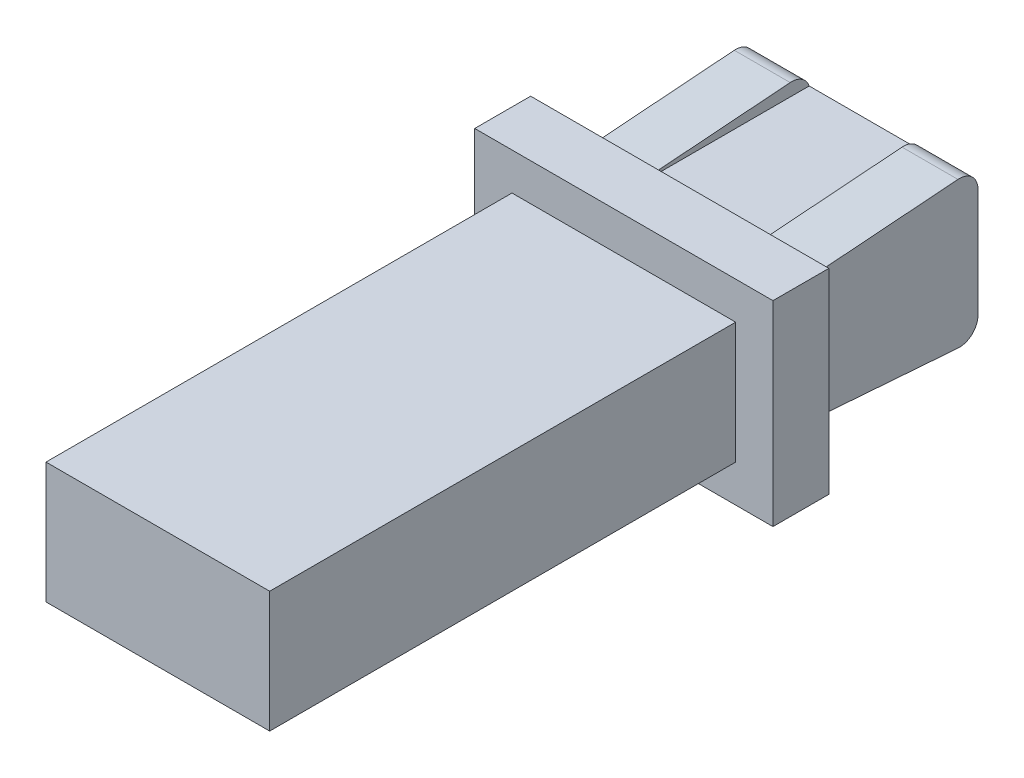
ISO-10303-21;
HEADER;
FILE_DESCRIPTION(('STEP AP214'),'2;1');
FILE_NAME('part.step','',(''),(''),'','','');
FILE_SCHEMA(('AUTOMOTIVE_DESIGN { 1 0 10303 214 1 1 1 1 }'));
ENDSEC;
DATA;
#1=APPLICATION_CONTEXT('core data for automotive mechanical design processes');
#2=APPLICATION_PROTOCOL_DEFINITION('international standard','automotive_design',2000,#1);
#3=PRODUCT_CONTEXT('',#1,'mechanical');
#4=PRODUCT('Part','Part','',(#3));
#5=PRODUCT_RELATED_PRODUCT_CATEGORY('part','',(#4));
#6=PRODUCT_DEFINITION_FORMATION('','',#4);
#7=PRODUCT_DEFINITION_CONTEXT('part definition',#1,'design');
#8=PRODUCT_DEFINITION('design','',#6,#7);
#9=PRODUCT_DEFINITION_SHAPE('','',#8);
#10=(LENGTH_UNIT() NAMED_UNIT(*) SI_UNIT(.MILLI.,.METRE.));
#11=(NAMED_UNIT(*) PLANE_ANGLE_UNIT() SI_UNIT($,.RADIAN.));
#12=(NAMED_UNIT(*) SI_UNIT($,.STERADIAN.) SOLID_ANGLE_UNIT());
#13=UNCERTAINTY_MEASURE_WITH_UNIT(LENGTH_MEASURE(1.E-05),#10,'distance_accuracy_value','');
#14=(GEOMETRIC_REPRESENTATION_CONTEXT(3) GLOBAL_UNCERTAINTY_ASSIGNED_CONTEXT((#13)) GLOBAL_UNIT_ASSIGNED_CONTEXT((#10,
#11,#12)) REPRESENTATION_CONTEXT('',''));
#15=CARTESIAN_POINT('',(0.,0.,0.));
#16=DIRECTION('',(0.,0.,1.));
#17=DIRECTION('',(1.,0.,0.));
#18=AXIS2_PLACEMENT_3D('',#15,#16,#17);
#19=CARTESIAN_POINT('',(-16.0280855600658,-3.25000000000001,10.));
#20=DIRECTION('',(0.,-0.997199309888456,0.0747899482416342));
#21=DIRECTION('',(0.,-0.0747899482416342,-0.997199309888456));
#22=AXIS2_PLACEMENT_3D('',#19,#20,#21);
#23=PLANE('',#22);
#24=DIRECTION('',(0.,-0.0747899482416342,-0.997199309888456));
#25=VECTOR('',#24,1.);
#26=CARTESIAN_POINT('',(3.,-1.1654317731485,37.7942430246866));
#27=LINE('',#26,#25);
#28=CARTESIAN_POINT('',(3.,-3.25,10.));
#29=VERTEX_POINT('',#28);
#30=CARTESIAN_POINT('',(3.,-3.91939075388188,1.07478994824164));
#31=VERTEX_POINT('',#30);
#32=EDGE_CURVE('E233',#29,#31,#27,.T.);
#33=ORIENTED_EDGE('',*,*,#32,.T.);
#34=DIRECTION('',(1.,0.,0.));
#35=VECTOR('',#34,1.);
#36=CARTESIAN_POINT('',(6.,-3.91939075388188,1.07478994824164));
#37=LINE('',#36,#35);
#38=CARTESIAN_POINT('',(6.,-3.91939075388188,1.07478994824164));
#39=VERTEX_POINT('',#38);
#40=EDGE_CURVE('E363',#31,#39,#37,.T.);
#41=ORIENTED_EDGE('',*,*,#40,.T.);
#42=DIRECTION('',(0.,-0.0747899482416342,-0.997199309888456));
#43=VECTOR('',#42,1.);
#44=CARTESIAN_POINT('',(6.,-3.25,10.));
#45=LINE('',#44,#43);
#46=CARTESIAN_POINT('',(6.,-3.25,10.));
#47=VERTEX_POINT('',#46);
#48=EDGE_CURVE('E257',#47,#39,#45,.T.);
#49=ORIENTED_EDGE('',*,*,#48,.F.);
#50=DIRECTION('',(1.,0.,0.));
#51=VECTOR('',#50,1.);
#52=CARTESIAN_POINT('',(-6.,-3.25,10.));
#53=LINE('',#52,#51);
#54=EDGE_CURVE('E359',#29,#47,#53,.T.);
#55=ORIENTED_EDGE('',*,*,#54,.F.);
#56=EDGE_LOOP('',(#33,#41,#49,#55));
#57=FACE_BOUND('',#56,.T.);
#58=ADVANCED_FACE('F38',(#57),#23,.T.);
#59=CARTESIAN_POINT('',(-16.0280855600658,3.24999999999999,10.));
#60=DIRECTION('',(0.,0.997199309888456,0.0747899482416342));
#61=DIRECTION('',(0.,-0.0747899482416342,0.997199309888456));
#62=AXIS2_PLACEMENT_3D('',#59,#60,#61);
#63=PLANE('',#62);
#64=DIRECTION('',(0.,0.0747899482416342,-0.997199309888456));
#65=VECTOR('',#64,1.);
#66=CARTESIAN_POINT('',(-3.,1.1654317731485,37.7942430246866));
#67=LINE('',#66,#65);
#68=CARTESIAN_POINT('',(-3.,3.25,10.));
#69=VERTEX_POINT('',#68);
#70=CARTESIAN_POINT('',(-3.,3.91939075388187,1.07478994824163));
#71=VERTEX_POINT('',#70);
#72=EDGE_CURVE('E177',#69,#71,#67,.T.);
#73=ORIENTED_EDGE('',*,*,#72,.T.);
#74=DIRECTION('',(1.,0.,0.));
#75=VECTOR('',#74,1.);
#76=CARTESIAN_POINT('',(-6.,3.91939075388187,1.07478994824163));
#77=LINE('',#76,#75);
#78=CARTESIAN_POINT('',(-6.,3.91939075388187,1.07478994824163));
#79=VERTEX_POINT('',#78);
#80=EDGE_CURVE('E47',#71,#79,#77,.F.);
#81=ORIENTED_EDGE('',*,*,#80,.T.);
#82=DIRECTION('',(0.,0.0747899482416342,-0.997199309888456));
#83=VECTOR('',#82,1.);
#84=CARTESIAN_POINT('',(-6.,3.25,10.));
#85=LINE('',#84,#83);
#86=CARTESIAN_POINT('',(-6.,3.25,10.));
#87=VERTEX_POINT('',#86);
#88=EDGE_CURVE('E201',#87,#79,#85,.T.);
#89=ORIENTED_EDGE('',*,*,#88,.F.);
#90=DIRECTION('',(-1.,0.,0.));
#91=VECTOR('',#90,1.);
#92=CARTESIAN_POINT('',(-6.,3.25,10.));
#93=LINE('',#92,#91);
#94=EDGE_CURVE('E198',#69,#87,#93,.T.);
#95=ORIENTED_EDGE('',*,*,#94,.F.);
#96=EDGE_LOOP('',(#73,#81,#89,#95));
#97=FACE_BOUND('',#96,.T.);
#98=ADVANCED_FACE('F199',(#97),#63,.T.);
#99=CARTESIAN_POINT('',(6.,3.25,10.));
#100=DIRECTION('',(-1.,0.,0.));
#101=DIRECTION('',(0.,-1.,0.));
#102=AXIS2_PLACEMENT_3D('',#99,#100,#101);
#103=PLANE('',#102);
#104=ORIENTED_EDGE('',*,*,#48,.T.);
#105=CARTESIAN_POINT('',(6.,-2.92219144399342,1.));
#106=DIRECTION('',(-1.,0.,0.));
#107=DIRECTION('',(0.,-1.,0.));
#108=AXIS2_PLACEMENT_3D('',#105,#106,#107);
#109=CIRCLE('',#108,1.);
#110=CARTESIAN_POINT('',(6.,-2.92219144399342,0.));
#111=VERTEX_POINT('',#110);
#112=EDGE_CURVE('E377',#39,#111,#109,.F.);
#113=ORIENTED_EDGE('',*,*,#112,.T.);
#114=DIRECTION('',(0.,1.,0.));
#115=VECTOR('',#114,1.);
#116=CARTESIAN_POINT('',(6.,3.25,0.));
#117=LINE('',#116,#115);
#118=CARTESIAN_POINT('',(6.,2.92219144399342,0.));
#119=VERTEX_POINT('',#118);
#120=EDGE_CURVE('E351',#111,#119,#117,.T.);
#121=ORIENTED_EDGE('',*,*,#120,.T.);
#122=CARTESIAN_POINT('',(6.,2.92219144399342,1.));
#123=DIRECTION('',(-1.,0.,0.));
#124=DIRECTION('',(0.,-1.,0.));
#125=AXIS2_PLACEMENT_3D('',#122,#123,#124);
#126=CIRCLE('',#125,1.);
#127=CARTESIAN_POINT('',(6.,3.91939075388188,1.07478994824163));
#128=VERTEX_POINT('',#127);
#129=EDGE_CURVE('E374',#119,#128,#126,.F.);
#130=ORIENTED_EDGE('',*,*,#129,.T.);
#131=DIRECTION('',(0.,-0.0747899482416342,0.997199309888456));
#132=VECTOR('',#131,1.);
#133=CARTESIAN_POINT('',(6.,3.25,10.));
#134=LINE('',#133,#132);
#135=CARTESIAN_POINT('',(6.,3.25,10.));
#136=VERTEX_POINT('',#135);
#137=EDGE_CURVE('E227',#128,#136,#134,.T.);
#138=ORIENTED_EDGE('',*,*,#137,.T.);
#139=DIRECTION('',(0.,1.,0.));
#140=VECTOR('',#139,1.);
#141=CARTESIAN_POINT('',(6.,3.25,10.));
#142=LINE('',#141,#140);
#143=EDGE_CURVE('E207',#47,#136,#142,.T.);
#144=ORIENTED_EDGE('',*,*,#143,.F.);
#145=EDGE_LOOP('',(#104,#113,#121,#130,#138,#144));
#146=FACE_BOUND('',#145,.T.);
#147=ADVANCED_FACE('F406',(#146),#103,.F.);
#148=CARTESIAN_POINT('',(-6.,3.25,10.));
#149=DIRECTION('',(1.,0.,0.));
#150=DIRECTION('',(0.,1.,0.));
#151=AXIS2_PLACEMENT_3D('',#148,#149,#150);
#152=PLANE('',#151);
#153=DIRECTION('',(0.,-1.,0.));
#154=VECTOR('',#153,1.);
#155=CARTESIAN_POINT('',(-6.,3.25,0.));
#156=LINE('',#155,#154);
#157=CARTESIAN_POINT('',(-6.,2.92219144399342,0.));
#158=VERTEX_POINT('',#157);
#159=CARTESIAN_POINT('',(-6.,-2.92219144399342,0.));
#160=VERTEX_POINT('',#159);
#161=EDGE_CURVE('E353',#158,#160,#156,.T.);
#162=ORIENTED_EDGE('',*,*,#161,.T.);
#163=CARTESIAN_POINT('',(-6.,-2.92219144399342,1.));
#164=DIRECTION('',(1.,0.,0.));
#165=DIRECTION('',(0.,1.,0.));
#166=AXIS2_PLACEMENT_3D('',#163,#164,#165);
#167=CIRCLE('',#166,1.);
#168=CARTESIAN_POINT('',(-6.,-3.91939075388188,1.07478994824164));
#169=VERTEX_POINT('',#168);
#170=EDGE_CURVE('E389',#160,#169,#167,.F.);
#171=ORIENTED_EDGE('',*,*,#170,.T.);
#172=DIRECTION('',(0.,0.0747899482416342,0.997199309888456));
#173=VECTOR('',#172,1.);
#174=CARTESIAN_POINT('',(-6.,-3.25,10.));
#175=LINE('',#174,#173);
#176=CARTESIAN_POINT('',(-6.,-3.25,10.));
#177=VERTEX_POINT('',#176);
#178=EDGE_CURVE('E258',#169,#177,#175,.T.);
#179=ORIENTED_EDGE('',*,*,#178,.T.);
#180=DIRECTION('',(0.,-1.,0.));
#181=VECTOR('',#180,1.);
#182=CARTESIAN_POINT('',(-6.,3.25,10.));
#183=LINE('',#182,#181);
#184=EDGE_CURVE('E356',#87,#177,#183,.T.);
#185=ORIENTED_EDGE('',*,*,#184,.F.);
#186=ORIENTED_EDGE('',*,*,#88,.T.);
#187=CARTESIAN_POINT('',(-6.,2.92219144399342,1.));
#188=DIRECTION('',(1.,0.,0.));
#189=DIRECTION('',(0.,1.,0.));
#190=AXIS2_PLACEMENT_3D('',#187,#188,#189);
#191=CIRCLE('',#190,1.);
#192=EDGE_CURVE('E387',#79,#158,#191,.F.);
#193=ORIENTED_EDGE('',*,*,#192,.T.);
#194=EDGE_LOOP('',(#162,#171,#179,#185,#186,#193));
#195=FACE_BOUND('',#194,.T.);
#196=ADVANCED_FACE('F397',(#195),#152,.F.);
#197=CARTESIAN_POINT('',(0.,0.,0.));
#198=DIRECTION('',(0.,0.,1.));
#199=DIRECTION('',(1.,0.,0.));
#200=AXIS2_PLACEMENT_3D('',#197,#198,#199);
#201=PLANE('',#200);
#202=ORIENTED_EDGE('',*,*,#120,.F.);
#203=DIRECTION('',(1.,0.,0.));
#204=VECTOR('',#203,1.);
#205=CARTESIAN_POINT('',(-6.,-2.92219144399342,0.));
#206=LINE('',#205,#204);
#207=EDGE_CURVE('E384',#111,#160,#206,.F.);
#208=ORIENTED_EDGE('',*,*,#207,.T.);
#209=ORIENTED_EDGE('',*,*,#161,.F.);
#210=DIRECTION('',(1.,0.,0.));
#211=VECTOR('',#210,1.);
#212=CARTESIAN_POINT('',(6.,2.92219144399342,0.));
#213=LINE('',#212,#211);
#214=EDGE_CURVE('E380',#158,#119,#213,.T.);
#215=ORIENTED_EDGE('',*,*,#214,.T.);
#216=EDGE_LOOP('',(#202,#208,#209,#215));
#217=FACE_BOUND('',#216,.T.);
#218=ADVANCED_FACE('F403',(#217),#201,.F.);
#219=CARTESIAN_POINT('',(0.,0.,10.));
#220=DIRECTION('',(0.,0.,1.));
#221=DIRECTION('',(1.,0.,0.));
#222=AXIS2_PLACEMENT_3D('',#219,#220,#221);
#223=PLANE('',#222);
#224=DIRECTION('',(1.,0.,0.));
#225=VECTOR('',#224,1.);
#226=CARTESIAN_POINT('',(-8.,-5.25,10.));
#227=LINE('',#226,#225);
#228=CARTESIAN_POINT('',(-8.,-5.25,10.));
#229=VERTEX_POINT('',#228);
#230=CARTESIAN_POINT('',(8.,-5.25,10.));
#231=VERTEX_POINT('',#230);
#232=EDGE_CURVE('E309',#229,#231,#227,.T.);
#233=ORIENTED_EDGE('',*,*,#232,.F.);
#234=DIRECTION('',(0.,-1.,0.));
#235=VECTOR('',#234,1.);
#236=CARTESIAN_POINT('',(-8.,5.25,10.));
#237=LINE('',#236,#235);
#238=CARTESIAN_POINT('',(-8.,5.25,10.));
#239=VERTEX_POINT('',#238);
#240=EDGE_CURVE('E315',#239,#229,#237,.T.);
#241=ORIENTED_EDGE('',*,*,#240,.F.);
#242=DIRECTION('',(-1.,0.,0.));
#243=VECTOR('',#242,1.);
#244=CARTESIAN_POINT('',(8.,5.25,10.));
#245=LINE('',#244,#243);
#246=CARTESIAN_POINT('',(8.,5.25,10.));
#247=VERTEX_POINT('',#246);
#248=EDGE_CURVE('E331',#247,#239,#245,.T.);
#249=ORIENTED_EDGE('',*,*,#248,.F.);
#250=DIRECTION('',(0.,1.,0.));
#251=VECTOR('',#250,1.);
#252=CARTESIAN_POINT('',(8.,-5.25,10.));
#253=LINE('',#252,#251);
#254=EDGE_CURVE('E328',#231,#247,#253,.T.);
#255=ORIENTED_EDGE('',*,*,#254,.F.);
#256=EDGE_LOOP('',(#233,#241,#249,#255));
#257=FACE_BOUND('',#256,.T.);
#258=CARTESIAN_POINT('',(-3.,-3.25,10.));
#259=VERTEX_POINT('',#258);
#260=EDGE_CURVE('E360',#177,#259,#53,.T.);
#261=ORIENTED_EDGE('',*,*,#260,.T.);
#262=DIRECTION('',(1.,0.,0.));
#263=VECTOR('',#262,1.);
#264=CARTESIAN_POINT('',(-6.,-3.25,10.));
#265=LINE('',#264,#263);
#266=EDGE_CURVE('E244',#259,#29,#265,.T.);
#267=ORIENTED_EDGE('',*,*,#266,.T.);
#268=ORIENTED_EDGE('',*,*,#54,.T.);
#269=ORIENTED_EDGE('',*,*,#143,.T.);
#270=CARTESIAN_POINT('',(3.,3.25,10.));
#271=VERTEX_POINT('',#270);
#272=EDGE_CURVE('E206',#136,#271,#93,.T.);
#273=ORIENTED_EDGE('',*,*,#272,.T.);
#274=DIRECTION('',(-1.,0.,0.));
#275=VECTOR('',#274,1.);
#276=CARTESIAN_POINT('',(3.0000000000001,3.25,9.99999999999998));
#277=LINE('',#276,#275);
#278=EDGE_CURVE('E193',#271,#69,#277,.T.);
#279=ORIENTED_EDGE('',*,*,#278,.T.);
#280=ORIENTED_EDGE('',*,*,#94,.T.);
#281=ORIENTED_EDGE('',*,*,#184,.T.);
#282=EDGE_LOOP('',(#261,#267,#268,#269,#273,#279,#280,#281));
#283=FACE_BOUND('',#282,.T.);
#284=ADVANCED_FACE('F211',(#257,#283),#223,.F.);
#285=CARTESIAN_POINT('',(-8.,-5.25,13.));
#286=DIRECTION('',(0.,1.,0.));
#287=DIRECTION('',(0.,0.,1.));
#288=AXIS2_PLACEMENT_3D('',#285,#286,#287);
#289=PLANE('',#288);
#290=ORIENTED_EDGE('',*,*,#232,.T.);
#291=DIRECTION('',(0.,0.,-1.));
#292=VECTOR('',#291,1.);
#293=CARTESIAN_POINT('',(8.,-5.25,13.));
#294=LINE('',#293,#292);
#295=CARTESIAN_POINT('',(8.,-5.25,13.));
#296=VERTEX_POINT('',#295);
#297=EDGE_CURVE('E347',#296,#231,#294,.T.);
#298=ORIENTED_EDGE('',*,*,#297,.F.);
#299=DIRECTION('',(1.,0.,0.));
#300=VECTOR('',#299,1.);
#301=CARTESIAN_POINT('',(-8.,-5.25,13.));
#302=LINE('',#301,#300);
#303=CARTESIAN_POINT('',(-8.,-5.25,13.));
#304=VERTEX_POINT('',#303);
#305=EDGE_CURVE('E310',#304,#296,#302,.T.);
#306=ORIENTED_EDGE('',*,*,#305,.F.);
#307=DIRECTION('',(0.,0.,-1.));
#308=VECTOR('',#307,1.);
#309=CARTESIAN_POINT('',(-8.,-5.25,13.));
#310=LINE('',#309,#308);
#311=EDGE_CURVE('E324',#304,#229,#310,.T.);
#312=ORIENTED_EDGE('',*,*,#311,.T.);
#313=EDGE_LOOP('',(#290,#298,#306,#312));
#314=FACE_BOUND('',#313,.T.);
#315=ADVANCED_FACE('F478',(#314),#289,.F.);
#316=CARTESIAN_POINT('',(8.,-5.25,13.));
#317=DIRECTION('',(-1.,0.,0.));
#318=DIRECTION('',(0.,-1.,0.));
#319=AXIS2_PLACEMENT_3D('',#316,#317,#318);
#320=PLANE('',#319);
#321=ORIENTED_EDGE('',*,*,#254,.T.);
#322=DIRECTION('',(0.,0.,-1.));
#323=VECTOR('',#322,1.);
#324=CARTESIAN_POINT('',(8.,5.25,13.));
#325=LINE('',#324,#323);
#326=CARTESIAN_POINT('',(8.,5.25,13.));
#327=VERTEX_POINT('',#326);
#328=EDGE_CURVE('E343',#327,#247,#325,.T.);
#329=ORIENTED_EDGE('',*,*,#328,.F.);
#330=DIRECTION('',(0.,1.,0.));
#331=VECTOR('',#330,1.);
#332=CARTESIAN_POINT('',(8.,-5.25,13.));
#333=LINE('',#332,#331);
#334=EDGE_CURVE('E314',#296,#327,#333,.T.);
#335=ORIENTED_EDGE('',*,*,#334,.F.);
#336=ORIENTED_EDGE('',*,*,#297,.T.);
#337=EDGE_LOOP('',(#321,#329,#335,#336));
#338=FACE_BOUND('',#337,.T.);
#339=ADVANCED_FACE('F486',(#338),#320,.F.);
#340=CARTESIAN_POINT('',(8.,5.25,13.));
#341=DIRECTION('',(0.,-1.,0.));
#342=DIRECTION('',(0.,0.,-1.));
#343=AXIS2_PLACEMENT_3D('',#340,#341,#342);
#344=PLANE('',#343);
#345=ORIENTED_EDGE('',*,*,#248,.T.);
#346=DIRECTION('',(0.,0.,-1.));
#347=VECTOR('',#346,1.);
#348=CARTESIAN_POINT('',(-8.,5.25,13.));
#349=LINE('',#348,#347);
#350=CARTESIAN_POINT('',(-8.,5.25,13.));
#351=VERTEX_POINT('',#350);
#352=EDGE_CURVE('E339',#351,#239,#349,.T.);
#353=ORIENTED_EDGE('',*,*,#352,.F.);
#354=DIRECTION('',(-1.,0.,0.));
#355=VECTOR('',#354,1.);
#356=CARTESIAN_POINT('',(8.,5.25,13.));
#357=LINE('',#356,#355);
#358=EDGE_CURVE('E318',#327,#351,#357,.T.);
#359=ORIENTED_EDGE('',*,*,#358,.F.);
#360=ORIENTED_EDGE('',*,*,#328,.T.);
#361=EDGE_LOOP('',(#345,#353,#359,#360));
#362=FACE_BOUND('',#361,.T.);
#363=ADVANCED_FACE('F482',(#362),#344,.F.);
#364=CARTESIAN_POINT('',(-8.,5.25,13.));
#365=DIRECTION('',(1.,0.,0.));
#366=DIRECTION('',(0.,1.,0.));
#367=AXIS2_PLACEMENT_3D('',#364,#365,#366);
#368=PLANE('',#367);
#369=ORIENTED_EDGE('',*,*,#240,.T.);
#370=ORIENTED_EDGE('',*,*,#311,.F.);
#371=DIRECTION('',(0.,-1.,0.));
#372=VECTOR('',#371,1.);
#373=CARTESIAN_POINT('',(-8.,5.25,13.));
#374=LINE('',#373,#372);
#375=EDGE_CURVE('E321',#351,#304,#374,.T.);
#376=ORIENTED_EDGE('',*,*,#375,.F.);
#377=ORIENTED_EDGE('',*,*,#352,.T.);
#378=EDGE_LOOP('',(#369,#370,#376,#377));
#379=FACE_BOUND('',#378,.T.);
#380=ADVANCED_FACE('F474',(#379),#368,.F.);
#381=CARTESIAN_POINT('',(0.,0.,13.));
#382=DIRECTION('',(0.,0.,1.));
#383=DIRECTION('',(1.,0.,0.));
#384=AXIS2_PLACEMENT_3D('',#381,#382,#383);
#385=PLANE('',#384);
#386=DIRECTION('',(0.,-1.,0.));
#387=VECTOR('',#386,1.);
#388=CARTESIAN_POINT('',(-6.,3.25,13.));
#389=LINE('',#388,#387);
#390=CARTESIAN_POINT('',(-6.,3.25,13.));
#391=VERTEX_POINT('',#390);
#392=CARTESIAN_POINT('',(-6.,-3.25,13.));
#393=VERTEX_POINT('',#392);
#394=EDGE_CURVE('E261',#391,#393,#389,.T.);
#395=ORIENTED_EDGE('',*,*,#394,.F.);
#396=DIRECTION('',(-1.,0.,0.));
#397=VECTOR('',#396,1.);
#398=CARTESIAN_POINT('',(6.,3.25,13.));
#399=LINE('',#398,#397);
#400=CARTESIAN_POINT('',(6.,3.25,13.));
#401=VERTEX_POINT('',#400);
#402=EDGE_CURVE('E270',#401,#391,#399,.T.);
#403=ORIENTED_EDGE('',*,*,#402,.F.);
#404=DIRECTION('',(0.,1.,0.));
#405=VECTOR('',#404,1.);
#406=CARTESIAN_POINT('',(6.,-3.25,13.));
#407=LINE('',#406,#405);
#408=CARTESIAN_POINT('',(6.,-3.25,13.));
#409=VERTEX_POINT('',#408);
#410=EDGE_CURVE('E287',#409,#401,#407,.T.);
#411=ORIENTED_EDGE('',*,*,#410,.F.);
#412=DIRECTION('',(1.,0.,0.));
#413=VECTOR('',#412,1.);
#414=CARTESIAN_POINT('',(-6.,-3.25,13.));
#415=LINE('',#414,#413);
#416=EDGE_CURVE('E283',#393,#409,#415,.T.);
#417=ORIENTED_EDGE('',*,*,#416,.F.);
#418=EDGE_LOOP('',(#395,#403,#411,#417));
#419=FACE_BOUND('',#418,.T.);
#420=ORIENTED_EDGE('',*,*,#305,.T.);
#421=ORIENTED_EDGE('',*,*,#334,.T.);
#422=ORIENTED_EDGE('',*,*,#358,.T.);
#423=ORIENTED_EDGE('',*,*,#375,.T.);
#424=EDGE_LOOP('',(#420,#421,#422,#423));
#425=FACE_BOUND('',#424,.T.);
#426=ADVANCED_FACE('F470',(#419,#425),#385,.T.);
#427=CARTESIAN_POINT('',(-6.,3.25,38.));
#428=DIRECTION('',(1.,0.,0.));
#429=DIRECTION('',(0.,1.,0.));
#430=AXIS2_PLACEMENT_3D('',#427,#428,#429);
#431=PLANE('',#430);
#432=ORIENTED_EDGE('',*,*,#394,.T.);
#433=DIRECTION('',(0.,0.,-1.));
#434=VECTOR('',#433,1.);
#435=CARTESIAN_POINT('',(-6.,-3.25,38.));
#436=LINE('',#435,#434);
#437=CARTESIAN_POINT('',(-6.,-3.25,38.));
#438=VERTEX_POINT('',#437);
#439=EDGE_CURVE('E305',#438,#393,#436,.T.);
#440=ORIENTED_EDGE('',*,*,#439,.F.);
#441=DIRECTION('',(0.,-1.,0.));
#442=VECTOR('',#441,1.);
#443=CARTESIAN_POINT('',(-6.,3.25,38.));
#444=LINE('',#443,#442);
#445=CARTESIAN_POINT('',(-6.,3.25,38.));
#446=VERTEX_POINT('',#445);
#447=EDGE_CURVE('E265',#446,#438,#444,.T.);
#448=ORIENTED_EDGE('',*,*,#447,.F.);
#449=DIRECTION('',(0.,0.,-1.));
#450=VECTOR('',#449,1.);
#451=CARTESIAN_POINT('',(-6.,3.25,38.));
#452=LINE('',#451,#450);
#453=EDGE_CURVE('E279',#446,#391,#452,.T.);
#454=ORIENTED_EDGE('',*,*,#453,.T.);
#455=EDGE_LOOP('',(#432,#440,#448,#454));
#456=FACE_BOUND('',#455,.T.);
#457=ADVANCED_FACE('F466',(#456),#431,.F.);
#458=CARTESIAN_POINT('',(-6.,-3.25,38.));
#459=DIRECTION('',(0.,1.,0.));
#460=DIRECTION('',(0.,0.,1.));
#461=AXIS2_PLACEMENT_3D('',#458,#459,#460);
#462=PLANE('',#461);
#463=ORIENTED_EDGE('',*,*,#416,.T.);
#464=DIRECTION('',(0.,0.,-1.));
#465=VECTOR('',#464,1.);
#466=CARTESIAN_POINT('',(6.,-3.25,38.));
#467=LINE('',#466,#465);
#468=CARTESIAN_POINT('',(6.,-3.25,38.));
#469=VERTEX_POINT('',#468);
#470=EDGE_CURVE('E301',#469,#409,#467,.T.);
#471=ORIENTED_EDGE('',*,*,#470,.F.);
#472=DIRECTION('',(1.,0.,0.));
#473=VECTOR('',#472,1.);
#474=CARTESIAN_POINT('',(-6.,-3.25,38.));
#475=LINE('',#474,#473);
#476=EDGE_CURVE('E269',#438,#469,#475,.T.);
#477=ORIENTED_EDGE('',*,*,#476,.F.);
#478=ORIENTED_EDGE('',*,*,#439,.T.);
#479=EDGE_LOOP('',(#463,#471,#477,#478));
#480=FACE_BOUND('',#479,.T.);
#481=ADVANCED_FACE('F462',(#480),#462,.F.);
#482=CARTESIAN_POINT('',(6.,-3.25,38.));
#483=DIRECTION('',(-1.,0.,0.));
#484=DIRECTION('',(0.,-1.,0.));
#485=AXIS2_PLACEMENT_3D('',#482,#483,#484);
#486=PLANE('',#485);
#487=ORIENTED_EDGE('',*,*,#410,.T.);
#488=DIRECTION('',(0.,0.,-1.));
#489=VECTOR('',#488,1.);
#490=CARTESIAN_POINT('',(6.,3.25,38.));
#491=LINE('',#490,#489);
#492=CARTESIAN_POINT('',(6.,3.25,38.));
#493=VERTEX_POINT('',#492);
#494=EDGE_CURVE('E297',#493,#401,#491,.T.);
#495=ORIENTED_EDGE('',*,*,#494,.F.);
#496=DIRECTION('',(0.,1.,0.));
#497=VECTOR('',#496,1.);
#498=CARTESIAN_POINT('',(6.,-3.25,38.));
#499=LINE('',#498,#497);
#500=EDGE_CURVE('E273',#469,#493,#499,.T.);
#501=ORIENTED_EDGE('',*,*,#500,.F.);
#502=ORIENTED_EDGE('',*,*,#470,.T.);
#503=EDGE_LOOP('',(#487,#495,#501,#502));
#504=FACE_BOUND('',#503,.T.);
#505=ADVANCED_FACE('F458',(#504),#486,.F.);
#506=CARTESIAN_POINT('',(6.,3.25,38.));
#507=DIRECTION('',(0.,-1.,0.));
#508=DIRECTION('',(0.,0.,-1.));
#509=AXIS2_PLACEMENT_3D('',#506,#507,#508);
#510=PLANE('',#509);
#511=ORIENTED_EDGE('',*,*,#402,.T.);
#512=ORIENTED_EDGE('',*,*,#453,.F.);
#513=DIRECTION('',(-1.,0.,0.));
#514=VECTOR('',#513,1.);
#515=CARTESIAN_POINT('',(6.,3.25,38.));
#516=LINE('',#515,#514);
#517=EDGE_CURVE('E276',#493,#446,#516,.T.);
#518=ORIENTED_EDGE('',*,*,#517,.F.);
#519=ORIENTED_EDGE('',*,*,#494,.T.);
#520=EDGE_LOOP('',(#511,#512,#518,#519));
#521=FACE_BOUND('',#520,.T.);
#522=ADVANCED_FACE('F454',(#521),#510,.F.);
#523=CARTESIAN_POINT('',(0.,0.,38.));
#524=DIRECTION('',(0.,0.,1.));
#525=DIRECTION('',(1.,0.,0.));
#526=AXIS2_PLACEMENT_3D('',#523,#524,#525);
#527=PLANE('',#526);
#528=ORIENTED_EDGE('',*,*,#447,.T.);
#529=ORIENTED_EDGE('',*,*,#476,.T.);
#530=ORIENTED_EDGE('',*,*,#500,.T.);
#531=ORIENTED_EDGE('',*,*,#517,.T.);
#532=EDGE_LOOP('',(#528,#529,#530,#531));
#533=FACE_BOUND('',#532,.T.);
#534=ADVANCED_FACE('F443',(#533),#527,.T.);
#535=DIRECTION('',(0.,0.0747899482416342,0.997199309888456));
#536=VECTOR('',#535,1.);
#537=CARTESIAN_POINT('',(-3.,-1.16543177314851,37.7942430246866));
#538=LINE('',#537,#536);
#539=CARTESIAN_POINT('',(-3.,-3.91939075388188,1.07478994824164));
#540=VERTEX_POINT('',#539);
#541=EDGE_CURVE('E228',#540,#259,#538,.T.);
#542=ORIENTED_EDGE('',*,*,#541,.T.);
#543=ORIENTED_EDGE('',*,*,#260,.F.);
#544=ORIENTED_EDGE('',*,*,#178,.F.);
#545=EDGE_CURVE('E370',#169,#540,#37,.T.);
#546=ORIENTED_EDGE('',*,*,#545,.T.);
#547=EDGE_LOOP('',(#542,#543,#544,#546));
#548=FACE_BOUND('',#547,.T.);
#549=ADVANCED_FACE('F416',(#548),#23,.T.);
#550=DIRECTION('',(0.,-0.0747899482416342,0.997199309888456));
#551=VECTOR('',#550,1.);
#552=CARTESIAN_POINT('',(3.,1.1654317731485,37.7942430246866));
#553=LINE('',#552,#551);
#554=CARTESIAN_POINT('',(3.,3.91939075388188,1.07478994824163));
#555=VERTEX_POINT('',#554);
#556=EDGE_CURVE('E62',#555,#271,#553,.T.);
#557=ORIENTED_EDGE('',*,*,#556,.T.);
#558=ORIENTED_EDGE('',*,*,#272,.F.);
#559=ORIENTED_EDGE('',*,*,#137,.F.);
#560=EDGE_CURVE('E11',#128,#555,#77,.F.);
#561=ORIENTED_EDGE('',*,*,#560,.T.);
#562=EDGE_LOOP('',(#557,#558,#559,#561));
#563=FACE_BOUND('',#562,.T.);
#564=ADVANCED_FACE('F436',(#563),#63,.T.);
#565=CARTESIAN_POINT('',(-16.0280855600658,-2.92219144399343,1.));
#566=DIRECTION('',(-1.,0.,0.));
#567=DIRECTION('',(0.,-1.,0.));
#568=AXIS2_PLACEMENT_3D('',#565,#566,#567);
#569=CYLINDRICAL_SURFACE('',#568,1.);
#570=CARTESIAN_POINT('',(3.,-2.92219144399342,1.));
#571=DIRECTION('',(1.,0.,0.));
#572=DIRECTION('',(0.,0.,-1.));
#573=AXIS2_PLACEMENT_3D('',#570,#571,#572);
#574=CIRCLE('',#573,1.);
#575=CARTESIAN_POINT('',(3.,-3.25,0.0552558279571778));
#576=VERTEX_POINT('',#575);
#577=EDGE_CURVE('E236',#31,#576,#574,.T.);
#578=ORIENTED_EDGE('',*,*,#577,.T.);
#579=DIRECTION('',(-1.,0.,0.));
#580=VECTOR('',#579,1.);
#581=CARTESIAN_POINT('',(-16.0280855600658,-3.25,0.0552558279571761));
#582=LINE('',#581,#580);
#583=CARTESIAN_POINT('',(-3.,-3.25,0.0552558279571761));
#584=VERTEX_POINT('',#583);
#585=EDGE_CURVE('E215',#576,#584,#582,.T.);
#586=ORIENTED_EDGE('',*,*,#585,.T.);
#587=CARTESIAN_POINT('',(-3.,-2.92219144399342,1.));
#588=DIRECTION('',(-1.,0.,0.));
#589=DIRECTION('',(0.,0.,1.));
#590=AXIS2_PLACEMENT_3D('',#587,#588,#589);
#591=CIRCLE('',#590,1.);
#592=EDGE_CURVE('E232',#584,#540,#591,.T.);
#593=ORIENTED_EDGE('',*,*,#592,.T.);
#594=ORIENTED_EDGE('',*,*,#545,.F.);
#595=ORIENTED_EDGE('',*,*,#170,.F.);
#596=ORIENTED_EDGE('',*,*,#207,.F.);
#597=ORIENTED_EDGE('',*,*,#112,.F.);
#598=ORIENTED_EDGE('',*,*,#40,.F.);
#599=EDGE_LOOP('',(#578,#586,#593,#594,#595,#596,#597,#598));
#600=FACE_BOUND('',#599,.T.);
#601=ADVANCED_FACE('F413',(#600),#569,.T.);
#602=CARTESIAN_POINT('',(0.,2.92219144399342,1.));
#603=DIRECTION('',(-1.,0.,0.));
#604=DIRECTION('',(0.,-1.,0.));
#605=AXIS2_PLACEMENT_3D('',#602,#603,#604);
#606=CYLINDRICAL_SURFACE('',#605,1.);
#607=CARTESIAN_POINT('',(-3.,2.92219144399342,1.));
#608=DIRECTION('',(-1.,0.,0.));
#609=DIRECTION('',(0.,0.,1.));
#610=AXIS2_PLACEMENT_3D('',#607,#608,#609);
#611=CIRCLE('',#610,1.);
#612=CARTESIAN_POINT('',(-3.,3.25,0.0552558279571767));
#613=VERTEX_POINT('',#612);
#614=EDGE_CURVE('E182',#71,#613,#611,.T.);
#615=ORIENTED_EDGE('',*,*,#614,.T.);
#616=DIRECTION('',(-1.,0.,0.));
#617=VECTOR('',#616,1.);
#618=CARTESIAN_POINT('',(0.,3.25,0.0552558279571767));
#619=LINE('',#618,#617);
#620=CARTESIAN_POINT('',(3.,3.25,0.0552558279571791));
#621=VERTEX_POINT('',#620);
#622=EDGE_CURVE('E187',#613,#621,#619,.F.);
#623=ORIENTED_EDGE('',*,*,#622,.T.);
#624=CARTESIAN_POINT('',(3.,2.92219144399342,1.));
#625=DIRECTION('',(1.,0.,0.));
#626=DIRECTION('',(0.,0.,-1.));
#627=AXIS2_PLACEMENT_3D('',#624,#625,#626);
#628=CIRCLE('',#627,1.);
#629=EDGE_CURVE('E430',#621,#555,#628,.T.);
#630=ORIENTED_EDGE('',*,*,#629,.T.);
#631=ORIENTED_EDGE('',*,*,#560,.F.);
#632=ORIENTED_EDGE('',*,*,#129,.F.);
#633=ORIENTED_EDGE('',*,*,#214,.F.);
#634=ORIENTED_EDGE('',*,*,#192,.F.);
#635=ORIENTED_EDGE('',*,*,#80,.F.);
#636=EDGE_LOOP('',(#615,#623,#630,#631,#632,#633,#634,#635));
#637=FACE_BOUND('',#636,.T.);
#638=ADVANCED_FACE('F40',(#637),#606,.T.);
#639=CARTESIAN_POINT('',(3.,3.25,38.001));
#640=DIRECTION('',(0.,-1.,0.));
#641=DIRECTION('',(0.,0.,-1.));
#642=AXIS2_PLACEMENT_3D('',#639,#640,#641);
#643=PLANE('',#642);
#644=DIRECTION('',(0.,0.,-1.));
#645=VECTOR('',#644,1.);
#646=CARTESIAN_POINT('',(3.,3.25,38.001));
#647=LINE('',#646,#645);
#648=EDGE_CURVE('E224',#271,#621,#647,.T.);
#649=ORIENTED_EDGE('',*,*,#648,.T.);
#650=ORIENTED_EDGE('',*,*,#622,.F.);
#651=DIRECTION('',(0.,0.,-1.));
#652=VECTOR('',#651,1.);
#653=CARTESIAN_POINT('',(-3.,3.25,38.001));
#654=LINE('',#653,#652);
#655=EDGE_CURVE('E180',#69,#613,#654,.T.);
#656=ORIENTED_EDGE('',*,*,#655,.F.);
#657=ORIENTED_EDGE('',*,*,#278,.F.);
#658=EDGE_LOOP('',(#649,#650,#656,#657));
#659=FACE_BOUND('',#658,.T.);
#660=ADVANCED_FACE('F191',(#659),#643,.F.);
#661=CARTESIAN_POINT('',(-3.,3.92219144399342,38.001));
#662=DIRECTION('',(-1.,0.,0.));
#663=DIRECTION('',(0.,0.,1.));
#664=AXIS2_PLACEMENT_3D('',#661,#662,#663);
#665=PLANE('',#664);
#666=ORIENTED_EDGE('',*,*,#655,.T.);
#667=ORIENTED_EDGE('',*,*,#614,.F.);
#668=ORIENTED_EDGE('',*,*,#72,.F.);
#669=EDGE_LOOP('',(#666,#667,#668));
#670=FACE_BOUND('',#669,.T.);
#671=ADVANCED_FACE('F179',(#670),#665,.F.);
#672=CARTESIAN_POINT('',(3.,3.92219144399342,38.001));
#673=DIRECTION('',(1.,0.,0.));
#674=DIRECTION('',(0.,0.,-1.));
#675=AXIS2_PLACEMENT_3D('',#672,#673,#674);
#676=PLANE('',#675);
#677=ORIENTED_EDGE('',*,*,#629,.F.);
#678=ORIENTED_EDGE('',*,*,#648,.F.);
#679=ORIENTED_EDGE('',*,*,#556,.F.);
#680=EDGE_LOOP('',(#677,#678,#679));
#681=FACE_BOUND('',#680,.T.);
#682=ADVANCED_FACE('F599',(#681),#676,.F.);
#683=CARTESIAN_POINT('',(3.,-3.92219144399342,38.001));
#684=DIRECTION('',(1.,0.,0.));
#685=DIRECTION('',(0.,0.,-1.));
#686=AXIS2_PLACEMENT_3D('',#683,#684,#685);
#687=PLANE('',#686);
#688=DIRECTION('',(0.,0.,-1.));
#689=VECTOR('',#688,1.);
#690=CARTESIAN_POINT('',(3.,-3.25,38.001));
#691=LINE('',#690,#689);
#692=EDGE_CURVE('E219',#29,#576,#691,.T.);
#693=ORIENTED_EDGE('',*,*,#692,.T.);
#694=ORIENTED_EDGE('',*,*,#577,.F.);
#695=ORIENTED_EDGE('',*,*,#32,.F.);
#696=EDGE_LOOP('',(#693,#694,#695));
#697=FACE_BOUND('',#696,.T.);
#698=ADVANCED_FACE('F424',(#697),#687,.F.);
#699=CARTESIAN_POINT('',(-3.,-3.92219144399342,38.001));
#700=DIRECTION('',(-1.,0.,0.));
#701=DIRECTION('',(0.,0.,1.));
#702=AXIS2_PLACEMENT_3D('',#699,#700,#701);
#703=PLANE('',#702);
#704=ORIENTED_EDGE('',*,*,#592,.F.);
#705=DIRECTION('',(0.,0.,-1.));
#706=VECTOR('',#705,1.);
#707=CARTESIAN_POINT('',(-3.,-3.25,38.001));
#708=LINE('',#707,#706);
#709=EDGE_CURVE('E54',#259,#584,#708,.T.);
#710=ORIENTED_EDGE('',*,*,#709,.F.);
#711=ORIENTED_EDGE('',*,*,#541,.F.);
#712=EDGE_LOOP('',(#704,#710,#711));
#713=FACE_BOUND('',#712,.T.);
#714=ADVANCED_FACE('F422',(#713),#703,.F.);
#715=CARTESIAN_POINT('',(3.,-3.25,38.001));
#716=DIRECTION('',(0.,1.,0.));
#717=DIRECTION('',(0.,0.,1.));
#718=AXIS2_PLACEMENT_3D('',#715,#716,#717);
#719=PLANE('',#718);
#720=ORIENTED_EDGE('',*,*,#709,.T.);
#721=ORIENTED_EDGE('',*,*,#585,.F.);
#722=ORIENTED_EDGE('',*,*,#692,.F.);
#723=ORIENTED_EDGE('',*,*,#266,.F.);
#724=EDGE_LOOP('',(#720,#721,#722,#723));
#725=FACE_BOUND('',#724,.T.);
#726=ADVANCED_FACE('F420',(#725),#719,.F.);
#727=CLOSED_SHELL('',(#58,#98,#147,#196,#218,#284,#315,#339,#363,#380,#426,#457,#481,#505,#522,
#534,#549,#564,#601,#638,#660,#671,#682,#698,#714,#726));
#728=MANIFOLD_SOLID_BREP('B2',#727);
#729=ADVANCED_BREP_SHAPE_REPRESENTATION('',(#18,#728),#14);
#730=SHAPE_DEFINITION_REPRESENTATION(#9,#729);
ENDSEC;
END-ISO-10303-21;
